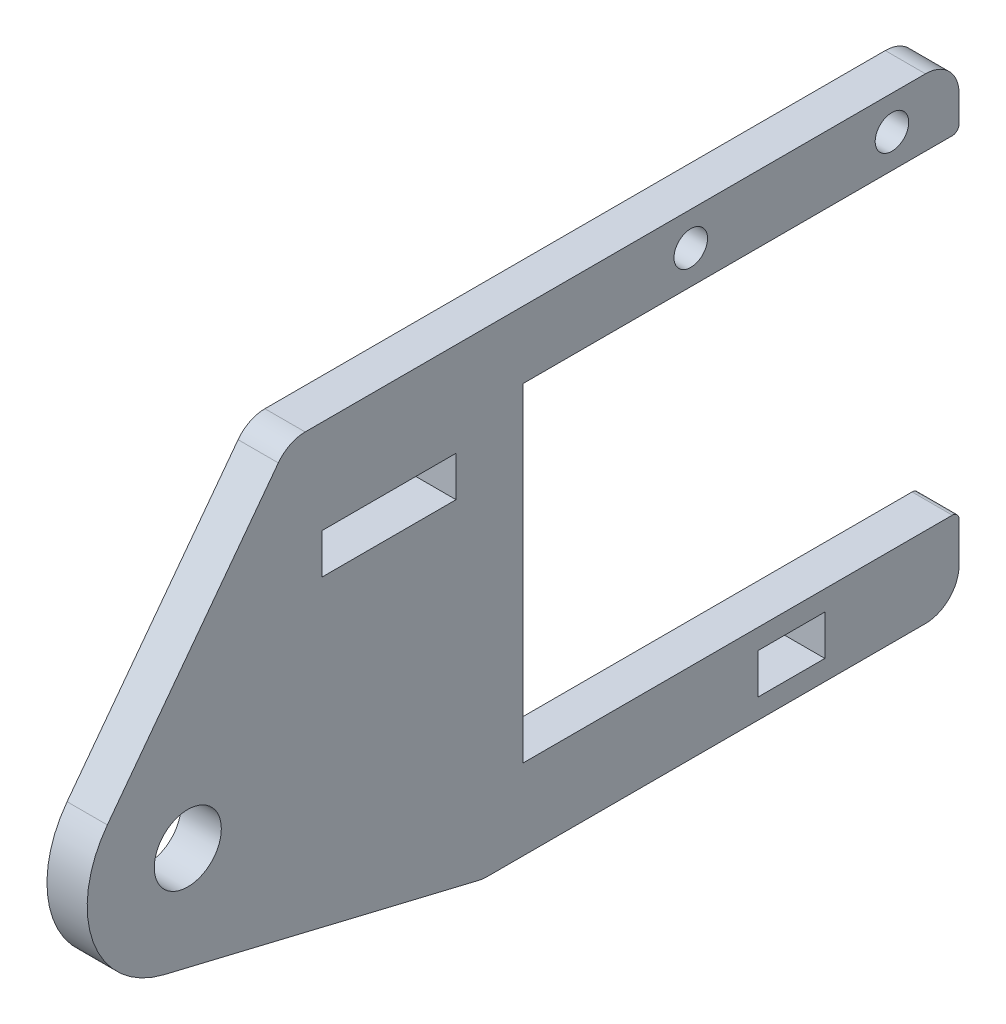
ISO-10303-21;
HEADER;
FILE_DESCRIPTION(('STEP AP214'),'2;1');
FILE_NAME('part.step','',(''),(''),'','','');
FILE_SCHEMA(('AUTOMOTIVE_DESIGN { 1 0 10303 214 1 1 1 1 }'));
ENDSEC;
DATA;
#1=APPLICATION_CONTEXT('core data for automotive mechanical design processes');
#2=APPLICATION_PROTOCOL_DEFINITION('international standard','automotive_design',2000,#1);
#3=PRODUCT_CONTEXT('',#1,'mechanical');
#4=PRODUCT('Part','Part','',(#3));
#5=PRODUCT_RELATED_PRODUCT_CATEGORY('part','',(#4));
#6=PRODUCT_DEFINITION_FORMATION('','',#4);
#7=PRODUCT_DEFINITION_CONTEXT('part definition',#1,'design');
#8=PRODUCT_DEFINITION('design','',#6,#7);
#9=PRODUCT_DEFINITION_SHAPE('','',#8);
#10=(LENGTH_UNIT() NAMED_UNIT(*) SI_UNIT(.MILLI.,.METRE.));
#11=(NAMED_UNIT(*) PLANE_ANGLE_UNIT() SI_UNIT($,.RADIAN.));
#12=(NAMED_UNIT(*) SI_UNIT($,.STERADIAN.) SOLID_ANGLE_UNIT());
#13=UNCERTAINTY_MEASURE_WITH_UNIT(LENGTH_MEASURE(1.E-05),#10,'distance_accuracy_value','');
#14=(GEOMETRIC_REPRESENTATION_CONTEXT(3) GLOBAL_UNCERTAINTY_ASSIGNED_CONTEXT((#13)) GLOBAL_UNIT_ASSIGNED_CONTEXT((#10,
#11,#12)) REPRESENTATION_CONTEXT('',''));
#15=CARTESIAN_POINT('',(0.,0.,0.));
#16=DIRECTION('',(0.,0.,1.));
#17=DIRECTION('',(1.,0.,0.));
#18=AXIS2_PLACEMENT_3D('',#15,#16,#17);
#19=CARTESIAN_POINT('',(6.,-30.,50.));
#20=DIRECTION('',(1.,0.,0.));
#21=DIRECTION('',(0.,0.,-1.));
#22=AXIS2_PLACEMENT_3D('',#19,#20,#21);
#23=PLANE('',#22);
#24=CARTESIAN_POINT('',(6.,10.,-55.));
#25=DIRECTION('',(1.,0.,0.));
#26=DIRECTION('',(0.,0.,-1.));
#27=AXIS2_PLACEMENT_3D('',#24,#25,#26);
#28=CIRCLE('',#27,2.5);
#29=CARTESIAN_POINT('',(6.,10.,-57.5));
#30=VERTEX_POINT('',#29);
#31=EDGE_CURVE('E267',#30,#30,#28,.T.);
#32=ORIENTED_EDGE('',*,*,#31,.F.);
#33=EDGE_LOOP('',(#32));
#34=FACE_BOUND('',#33,.T.);
#35=DIRECTION('',(0.,1.,0.));
#36=VECTOR('',#35,1.);
#37=CARTESIAN_POINT('',(6.,-56.,-65.));
#38=LINE('',#37,#36);
#39=CARTESIAN_POINT('',(6.,-51.,-65.));
#40=VERTEX_POINT('',#39);
#41=CARTESIAN_POINT('',(6.,-45.,-65.));
#42=VERTEX_POINT('',#41);
#43=EDGE_CURVE('E348',#40,#42,#38,.T.);
#44=ORIENTED_EDGE('',*,*,#43,.T.);
#45=CARTESIAN_POINT('',(6.,-45.,-64.));
#46=DIRECTION('',(1.,0.,0.));
#47=DIRECTION('',(0.,0.,-1.));
#48=AXIS2_PLACEMENT_3D('',#45,#46,#47);
#49=CIRCLE('',#48,1.);
#50=CARTESIAN_POINT('',(6.,-44.,-64.));
#51=VERTEX_POINT('',#50);
#52=EDGE_CURVE('E478',#42,#51,#49,.T.);
#53=ORIENTED_EDGE('',*,*,#52,.T.);
#54=DIRECTION('',(0.,0.,1.));
#55=VECTOR('',#54,1.);
#56=CARTESIAN_POINT('',(6.,-44.,-65.));
#57=LINE('',#56,#55);
#58=CARTESIAN_POINT('',(6.,-44.,0.));
#59=VERTEX_POINT('',#58);
#60=EDGE_CURVE('E352',#51,#59,#57,.T.);
#61=ORIENTED_EDGE('',*,*,#60,.T.);
#62=DIRECTION('',(0.,1.,0.));
#63=VECTOR('',#62,1.);
#64=CARTESIAN_POINT('',(6.,-44.,0.));
#65=LINE('',#64,#63);
#66=CARTESIAN_POINT('',(6.,5.,0.));
#67=VERTEX_POINT('',#66);
#68=EDGE_CURVE('E355',#59,#67,#65,.T.);
#69=ORIENTED_EDGE('',*,*,#68,.T.);
#70=DIRECTION('',(0.,0.,-1.));
#71=VECTOR('',#70,1.);
#72=CARTESIAN_POINT('',(6.,5.,0.));
#73=LINE('',#72,#71);
#74=CARTESIAN_POINT('',(6.,5.00000000000001,-64.));
#75=VERTEX_POINT('',#74);
#76=EDGE_CURVE('E358',#67,#75,#73,.T.);
#77=ORIENTED_EDGE('',*,*,#76,.T.);
#78=CARTESIAN_POINT('',(6.,6.00000000000001,-64.));
#79=DIRECTION('',(1.,0.,0.));
#80=DIRECTION('',(0.,0.,-1.));
#81=AXIS2_PLACEMENT_3D('',#78,#79,#80);
#82=CIRCLE('',#81,1.);
#83=CARTESIAN_POINT('',(6.,6.00000000000002,-65.));
#84=VERTEX_POINT('',#83);
#85=EDGE_CURVE('E59',#75,#84,#82,.T.);
#86=ORIENTED_EDGE('',*,*,#85,.T.);
#87=DIRECTION('',(0.,1.,0.));
#88=VECTOR('',#87,1.);
#89=CARTESIAN_POINT('',(6.,5.00000000000001,-65.));
#90=LINE('',#89,#88);
#91=CARTESIAN_POINT('',(6.,10.,-65.));
#92=VERTEX_POINT('',#91);
#93=EDGE_CURVE('E326',#84,#92,#90,.T.);
#94=ORIENTED_EDGE('',*,*,#93,.T.);
#95=CARTESIAN_POINT('',(6.,10.,-60.));
#96=DIRECTION('',(1.,0.,0.));
#97=DIRECTION('',(0.,0.,-1.));
#98=AXIS2_PLACEMENT_3D('',#95,#96,#97);
#99=CIRCLE('',#98,5.);
#100=CARTESIAN_POINT('',(6.,15.,-60.));
#101=VERTEX_POINT('',#100);
#102=EDGE_CURVE('E435',#92,#101,#99,.T.);
#103=ORIENTED_EDGE('',*,*,#102,.T.);
#104=DIRECTION('',(0.,0.,1.));
#105=VECTOR('',#104,1.);
#106=CARTESIAN_POINT('',(6.,15.,-65.));
#107=LINE('',#106,#105);
#108=CARTESIAN_POINT('',(6.,15.,32.5));
#109=VERTEX_POINT('',#108);
#110=EDGE_CURVE('E329',#101,#109,#107,.T.);
#111=ORIENTED_EDGE('',*,*,#110,.T.);
#112=CARTESIAN_POINT('',(6.,10.,32.5));
#113=DIRECTION('',(1.,0.,0.));
#114=DIRECTION('',(0.,0.,-1.));
#115=AXIS2_PLACEMENT_3D('',#112,#113,#114);
#116=CIRCLE('',#115,5.);
#117=CARTESIAN_POINT('',(6.,13.,36.5));
#118=VERTEX_POINT('',#117);
#119=EDGE_CURVE('E432',#109,#118,#116,.T.);
#120=ORIENTED_EDGE('',*,*,#119,.T.);
#121=DIRECTION('',(0.,-0.8,0.6));
#122=VECTOR('',#121,1.);
#123=CARTESIAN_POINT('',(6.,15.,35.));
#124=LINE('',#123,#122);
#125=CARTESIAN_POINT('',(6.,-21.,62.));
#126=VERTEX_POINT('',#125);
#127=EDGE_CURVE('E334',#118,#126,#124,.T.);
#128=ORIENTED_EDGE('',*,*,#127,.T.);
#129=CARTESIAN_POINT('',(6.,-30.,50.));
#130=DIRECTION('',(1.,0.,0.));
#131=DIRECTION('',(0.,0.,-1.));
#132=AXIS2_PLACEMENT_3D('',#129,#130,#131);
#133=CIRCLE('',#132,15.);
#134=CARTESIAN_POINT('',(6.,-44.5848301840766,53.5046723814998));
#135=VERTEX_POINT('',#134);
#136=EDGE_CURVE('E337',#126,#135,#133,.T.);
#137=ORIENTED_EDGE('',*,*,#136,.T.);
#138=DIRECTION('',(0.,-0.233644825433321,-0.972322012271774));
#139=VECTOR('',#138,1.);
#140=CARTESIAN_POINT('',(6.,-56.,5.99999999999999));
#141=LINE('',#140,#139);
#142=CARTESIAN_POINT('',(6.,-55.8616100613589,6.57591510262703));
#143=VERTEX_POINT('',#142);
#144=EDGE_CURVE('E340',#135,#143,#141,.T.);
#145=ORIENTED_EDGE('',*,*,#144,.T.);
#146=CARTESIAN_POINT('',(6.,-51.,5.40769097546042));
#147=DIRECTION('',(1.,0.,0.));
#148=DIRECTION('',(0.,0.,-1.));
#149=AXIS2_PLACEMENT_3D('',#146,#147,#148);
#150=CIRCLE('',#149,5.);
#151=CARTESIAN_POINT('',(6.,-56.,5.40769097546042));
#152=VERTEX_POINT('',#151);
#153=EDGE_CURVE('E441',#143,#152,#150,.T.);
#154=ORIENTED_EDGE('',*,*,#153,.T.);
#155=DIRECTION('',(0.,0.,-1.));
#156=VECTOR('',#155,1.);
#157=CARTESIAN_POINT('',(6.,-56.,5.99999999999999));
#158=LINE('',#157,#156);
#159=CARTESIAN_POINT('',(6.,-56.,-60.));
#160=VERTEX_POINT('',#159);
#161=EDGE_CURVE('E344',#152,#160,#158,.T.);
#162=ORIENTED_EDGE('',*,*,#161,.T.);
#163=CARTESIAN_POINT('',(6.,-51.,-60.));
#164=DIRECTION('',(1.,0.,0.));
#165=DIRECTION('',(0.,0.,-1.));
#166=AXIS2_PLACEMENT_3D('',#163,#164,#165);
#167=CIRCLE('',#166,5.);
#168=EDGE_CURVE('E438',#160,#40,#167,.T.);
#169=ORIENTED_EDGE('',*,*,#168,.T.);
#170=EDGE_LOOP('',(#44,#53,#61,#69,#77,#86,#94,#103,#111,#120,#128,#137,#145,#154,#162,#169));
#171=FACE_BOUND('',#170,.T.);
#172=CARTESIAN_POINT('',(6.,-30.,50.));
#173=DIRECTION('',(1.,0.,0.));
#174=DIRECTION('',(0.,0.,-1.));
#175=AXIS2_PLACEMENT_3D('',#172,#173,#174);
#176=CIRCLE('',#175,5.);
#177=CARTESIAN_POINT('',(6.,-30.,45.));
#178=VERTEX_POINT('',#177);
#179=EDGE_CURVE('E318',#178,#178,#176,.T.);
#180=ORIENTED_EDGE('',*,*,#179,.F.);
#181=EDGE_LOOP('',(#180));
#182=FACE_BOUND('',#181,.T.);
#183=DIRECTION('',(0.,0.,1.));
#184=VECTOR('',#183,1.);
#185=CARTESIAN_POINT('',(6.,-47.,-45.));
#186=LINE('',#185,#184);
#187=CARTESIAN_POINT('',(6.,-47.,-45.));
#188=VERTEX_POINT('',#187);
#189=CARTESIAN_POINT('',(6.,-47.,-35.));
#190=VERTEX_POINT('',#189);
#191=EDGE_CURVE('E278',#188,#190,#186,.T.);
#192=ORIENTED_EDGE('',*,*,#191,.F.);
#193=DIRECTION('',(0.,1.,0.));
#194=VECTOR('',#193,1.);
#195=CARTESIAN_POINT('',(6.,-47.,-45.));
#196=LINE('',#195,#194);
#197=CARTESIAN_POINT('',(6.,-53.,-45.));
#198=VERTEX_POINT('',#197);
#199=EDGE_CURVE('E275',#198,#188,#196,.T.);
#200=ORIENTED_EDGE('',*,*,#199,.F.);
#201=DIRECTION('',(0.,0.,-1.));
#202=VECTOR('',#201,1.);
#203=CARTESIAN_POINT('',(6.,-53.,-45.));
#204=LINE('',#203,#202);
#205=CARTESIAN_POINT('',(6.,-53.,-35.));
#206=VERTEX_POINT('',#205);
#207=EDGE_CURVE('E286',#206,#198,#204,.T.);
#208=ORIENTED_EDGE('',*,*,#207,.F.);
#209=DIRECTION('',(0.,-1.,0.));
#210=VECTOR('',#209,1.);
#211=CARTESIAN_POINT('',(6.,-47.,-35.));
#212=LINE('',#211,#210);
#213=EDGE_CURVE('E282',#190,#206,#212,.T.);
#214=ORIENTED_EDGE('',*,*,#213,.F.);
#215=EDGE_LOOP('',(#192,#200,#208,#214));
#216=FACE_BOUND('',#215,.T.);
#217=CARTESIAN_POINT('',(6.,10.,-25.));
#218=DIRECTION('',(1.,0.,0.));
#219=DIRECTION('',(0.,0.,-1.));
#220=AXIS2_PLACEMENT_3D('',#217,#218,#219);
#221=CIRCLE('',#220,2.5);
#222=CARTESIAN_POINT('',(6.,10.,-27.5));
#223=VERTEX_POINT('',#222);
#224=EDGE_CURVE('E259',#223,#223,#221,.T.);
#225=ORIENTED_EDGE('',*,*,#224,.F.);
#226=EDGE_LOOP('',(#225));
#227=FACE_BOUND('',#226,.T.);
#228=DIRECTION('',(0.,0.,1.));
#229=VECTOR('',#228,1.);
#230=CARTESIAN_POINT('',(6.,1.00000000000003,10.));
#231=LINE('',#230,#229);
#232=CARTESIAN_POINT('',(6.,1.00000000000003,10.));
#233=VERTEX_POINT('',#232);
#234=CARTESIAN_POINT('',(6.,1.00000000000001,30.));
#235=VERTEX_POINT('',#234);
#236=EDGE_CURVE('E217',#233,#235,#231,.T.);
#237=ORIENTED_EDGE('',*,*,#236,.F.);
#238=DIRECTION('',(0.,1.,0.));
#239=VECTOR('',#238,1.);
#240=CARTESIAN_POINT('',(6.,-4.99999999999997,10.));
#241=LINE('',#240,#239);
#242=CARTESIAN_POINT('',(6.,-4.99999999999997,10.));
#243=VERTEX_POINT('',#242);
#244=EDGE_CURVE('E206',#243,#233,#241,.T.);
#245=ORIENTED_EDGE('',*,*,#244,.F.);
#246=DIRECTION('',(0.,0.,-1.));
#247=VECTOR('',#246,1.);
#248=CARTESIAN_POINT('',(6.,-4.99999999999999,30.));
#249=LINE('',#248,#247);
#250=CARTESIAN_POINT('',(6.,-4.99999999999998,30.));
#251=VERTEX_POINT('',#250);
#252=EDGE_CURVE('E235',#251,#243,#249,.T.);
#253=ORIENTED_EDGE('',*,*,#252,.F.);
#254=DIRECTION('',(0.,-1.,0.));
#255=VECTOR('',#254,1.);
#256=CARTESIAN_POINT('',(6.,1.00000000000001,30.));
#257=LINE('',#256,#255);
#258=EDGE_CURVE('E231',#235,#251,#257,.T.);
#259=ORIENTED_EDGE('',*,*,#258,.F.);
#260=EDGE_LOOP('',(#237,#245,#253,#259));
#261=FACE_BOUND('',#260,.T.);
#262=ADVANCED_FACE('F43',(#34,#171,#182,#216,#227,#261),#23,.T.);
#263=CARTESIAN_POINT('',(0.,-30.,50.));
#264=DIRECTION('',(1.,0.,0.));
#265=DIRECTION('',(0.,0.,-1.));
#266=AXIS2_PLACEMENT_3D('',#263,#264,#265);
#267=PLANE('',#266);
#268=CARTESIAN_POINT('',(0.,10.,-25.));
#269=DIRECTION('',(1.,0.,0.));
#270=DIRECTION('',(0.,0.,-1.));
#271=AXIS2_PLACEMENT_3D('',#268,#269,#270);
#272=CIRCLE('',#271,2.5);
#273=CARTESIAN_POINT('',(0.,10.,-27.5));
#274=VERTEX_POINT('',#273);
#275=EDGE_CURVE('E226',#274,#274,#272,.T.);
#276=ORIENTED_EDGE('',*,*,#275,.T.);
#277=EDGE_LOOP('',(#276));
#278=FACE_BOUND('',#277,.T.);
#279=CARTESIAN_POINT('',(0.,10.,-55.));
#280=DIRECTION('',(1.,0.,0.));
#281=DIRECTION('',(0.,0.,-1.));
#282=AXIS2_PLACEMENT_3D('',#279,#280,#281);
#283=CIRCLE('',#282,2.5);
#284=CARTESIAN_POINT('',(0.,10.,-57.5));
#285=VERTEX_POINT('',#284);
#286=EDGE_CURVE('E263',#285,#285,#283,.T.);
#287=ORIENTED_EDGE('',*,*,#286,.T.);
#288=EDGE_LOOP('',(#287));
#289=FACE_BOUND('',#288,.T.);
#290=DIRECTION('',(0.,1.,0.));
#291=VECTOR('',#290,1.);
#292=CARTESIAN_POINT('',(0.,-47.,-45.));
#293=LINE('',#292,#291);
#294=CARTESIAN_POINT('',(0.,-53.,-45.));
#295=VERTEX_POINT('',#294);
#296=CARTESIAN_POINT('',(0.,-47.,-45.));
#297=VERTEX_POINT('',#296);
#298=EDGE_CURVE('E271',#295,#297,#293,.T.);
#299=ORIENTED_EDGE('',*,*,#298,.T.);
#300=DIRECTION('',(0.,0.,1.));
#301=VECTOR('',#300,1.);
#302=CARTESIAN_POINT('',(0.,-47.,-45.));
#303=LINE('',#302,#301);
#304=CARTESIAN_POINT('',(0.,-47.,-35.));
#305=VERTEX_POINT('',#304);
#306=EDGE_CURVE('E293',#297,#305,#303,.T.);
#307=ORIENTED_EDGE('',*,*,#306,.T.);
#308=DIRECTION('',(0.,-1.,0.));
#309=VECTOR('',#308,1.);
#310=CARTESIAN_POINT('',(0.,-47.,-35.));
#311=LINE('',#310,#309);
#312=CARTESIAN_POINT('',(0.,-53.,-35.));
#313=VERTEX_POINT('',#312);
#314=EDGE_CURVE('E297',#305,#313,#311,.T.);
#315=ORIENTED_EDGE('',*,*,#314,.T.);
#316=DIRECTION('',(0.,0.,-1.));
#317=VECTOR('',#316,1.);
#318=CARTESIAN_POINT('',(0.,-53.,-45.));
#319=LINE('',#318,#317);
#320=EDGE_CURVE('E279',#313,#295,#319,.T.);
#321=ORIENTED_EDGE('',*,*,#320,.T.);
#322=EDGE_LOOP('',(#299,#307,#315,#321));
#323=FACE_BOUND('',#322,.T.);
#324=DIRECTION('',(0.,0.,1.));
#325=VECTOR('',#324,1.);
#326=CARTESIAN_POINT('',(0.,-44.,-65.));
#327=LINE('',#326,#325);
#328=CARTESIAN_POINT('',(0.,-44.,-64.));
#329=VERTEX_POINT('',#328);
#330=CARTESIAN_POINT('',(0.,-44.,0.));
#331=VERTEX_POINT('',#330);
#332=EDGE_CURVE('E386',#329,#331,#327,.T.);
#333=ORIENTED_EDGE('',*,*,#332,.F.);
#334=CARTESIAN_POINT('',(0.,-45.,-64.));
#335=DIRECTION('',(1.,0.,0.));
#336=DIRECTION('',(0.,0.,-1.));
#337=AXIS2_PLACEMENT_3D('',#334,#335,#336);
#338=CIRCLE('',#337,1.);
#339=CARTESIAN_POINT('',(0.,-45.,-65.));
#340=VERTEX_POINT('',#339);
#341=EDGE_CURVE('E470',#329,#340,#338,.F.);
#342=ORIENTED_EDGE('',*,*,#341,.T.);
#343=DIRECTION('',(0.,1.,0.));
#344=VECTOR('',#343,1.);
#345=CARTESIAN_POINT('',(0.,-56.,-65.));
#346=LINE('',#345,#344);
#347=CARTESIAN_POINT('',(0.,-51.,-65.));
#348=VERTEX_POINT('',#347);
#349=EDGE_CURVE('E382',#348,#340,#346,.T.);
#350=ORIENTED_EDGE('',*,*,#349,.F.);
#351=CARTESIAN_POINT('',(0.,-51.,-60.));
#352=DIRECTION('',(1.,0.,0.));
#353=DIRECTION('',(0.,0.,-1.));
#354=AXIS2_PLACEMENT_3D('',#351,#352,#353);
#355=CIRCLE('',#354,5.);
#356=CARTESIAN_POINT('',(0.,-56.,-60.));
#357=VERTEX_POINT('',#356);
#358=EDGE_CURVE('E423',#348,#357,#355,.F.);
#359=ORIENTED_EDGE('',*,*,#358,.T.);
#360=DIRECTION('',(0.,0.,-1.));
#361=VECTOR('',#360,1.);
#362=CARTESIAN_POINT('',(0.,-56.,5.99999999999999));
#363=LINE('',#362,#361);
#364=CARTESIAN_POINT('',(0.,-56.,5.40769097546042));
#365=VERTEX_POINT('',#364);
#366=EDGE_CURVE('E378',#365,#357,#363,.T.);
#367=ORIENTED_EDGE('',*,*,#366,.F.);
#368=CARTESIAN_POINT('',(0.,-51.,5.40769097546042));
#369=DIRECTION('',(1.,0.,0.));
#370=DIRECTION('',(0.,0.,-1.));
#371=AXIS2_PLACEMENT_3D('',#368,#369,#370);
#372=CIRCLE('',#371,5.);
#373=CARTESIAN_POINT('',(0.,-55.8616100613589,6.57591510262703));
#374=VERTEX_POINT('',#373);
#375=EDGE_CURVE('E426',#365,#374,#372,.F.);
#376=ORIENTED_EDGE('',*,*,#375,.T.);
#377=DIRECTION('',(0.,-0.233644825433321,-0.972322012271774));
#378=VECTOR('',#377,1.);
#379=CARTESIAN_POINT('',(0.,-56.,5.99999999999999));
#380=LINE('',#379,#378);
#381=CARTESIAN_POINT('',(0.,-44.5848301840766,53.5046723814998));
#382=VERTEX_POINT('',#381);
#383=EDGE_CURVE('E374',#382,#374,#380,.T.);
#384=ORIENTED_EDGE('',*,*,#383,.F.);
#385=CARTESIAN_POINT('',(0.,-30.,50.));
#386=DIRECTION('',(1.,0.,0.));
#387=DIRECTION('',(0.,0.,-1.));
#388=AXIS2_PLACEMENT_3D('',#385,#386,#387);
#389=CIRCLE('',#388,15.);
#390=CARTESIAN_POINT('',(0.,-21.,62.));
#391=VERTEX_POINT('',#390);
#392=EDGE_CURVE('E371',#391,#382,#389,.T.);
#393=ORIENTED_EDGE('',*,*,#392,.F.);
#394=DIRECTION('',(0.,-0.8,0.6));
#395=VECTOR('',#394,1.);
#396=CARTESIAN_POINT('',(0.,15.,35.));
#397=LINE('',#396,#395);
#398=CARTESIAN_POINT('',(0.,13.,36.5));
#399=VERTEX_POINT('',#398);
#400=EDGE_CURVE('E368',#399,#391,#397,.T.);
#401=ORIENTED_EDGE('',*,*,#400,.F.);
#402=CARTESIAN_POINT('',(0.,10.,32.5));
#403=DIRECTION('',(1.,0.,0.));
#404=DIRECTION('',(0.,0.,-1.));
#405=AXIS2_PLACEMENT_3D('',#402,#403,#404);
#406=CIRCLE('',#405,5.);
#407=CARTESIAN_POINT('',(0.,15.,32.5));
#408=VERTEX_POINT('',#407);
#409=EDGE_CURVE('E416',#399,#408,#406,.F.);
#410=ORIENTED_EDGE('',*,*,#409,.T.);
#411=DIRECTION('',(0.,0.,1.));
#412=VECTOR('',#411,1.);
#413=CARTESIAN_POINT('',(0.,15.,-65.));
#414=LINE('',#413,#412);
#415=CARTESIAN_POINT('',(0.,15.,-60.));
#416=VERTEX_POINT('',#415);
#417=EDGE_CURVE('E364',#416,#408,#414,.T.);
#418=ORIENTED_EDGE('',*,*,#417,.F.);
#419=CARTESIAN_POINT('',(0.,10.,-60.));
#420=DIRECTION('',(1.,0.,0.));
#421=DIRECTION('',(0.,0.,-1.));
#422=AXIS2_PLACEMENT_3D('',#419,#420,#421);
#423=CIRCLE('',#422,5.);
#424=CARTESIAN_POINT('',(0.,10.,-65.));
#425=VERTEX_POINT('',#424);
#426=EDGE_CURVE('E419',#416,#425,#423,.F.);
#427=ORIENTED_EDGE('',*,*,#426,.T.);
#428=DIRECTION('',(0.,1.,0.));
#429=VECTOR('',#428,1.);
#430=CARTESIAN_POINT('',(0.,5.00000000000001,-65.));
#431=LINE('',#430,#429);
#432=CARTESIAN_POINT('',(0.,6.00000000000002,-65.));
#433=VERTEX_POINT('',#432);
#434=EDGE_CURVE('E322',#433,#425,#431,.T.);
#435=ORIENTED_EDGE('',*,*,#434,.F.);
#436=CARTESIAN_POINT('',(0.,6.00000000000001,-64.));
#437=DIRECTION('',(1.,0.,0.));
#438=DIRECTION('',(0.,0.,-1.));
#439=AXIS2_PLACEMENT_3D('',#436,#437,#438);
#440=CIRCLE('',#439,1.);
#441=CARTESIAN_POINT('',(0.,5.00000000000001,-64.));
#442=VERTEX_POINT('',#441);
#443=EDGE_CURVE('E467',#433,#442,#440,.F.);
#444=ORIENTED_EDGE('',*,*,#443,.T.);
#445=DIRECTION('',(0.,0.,-1.));
#446=VECTOR('',#445,1.);
#447=CARTESIAN_POINT('',(0.,5.,0.));
#448=LINE('',#447,#446);
#449=CARTESIAN_POINT('',(0.,5.,0.));
#450=VERTEX_POINT('',#449);
#451=EDGE_CURVE('E330',#450,#442,#448,.T.);
#452=ORIENTED_EDGE('',*,*,#451,.F.);
#453=DIRECTION('',(0.,1.,0.));
#454=VECTOR('',#453,1.);
#455=CARTESIAN_POINT('',(0.,-44.,0.));
#456=LINE('',#455,#454);
#457=EDGE_CURVE('E389',#331,#450,#456,.T.);
#458=ORIENTED_EDGE('',*,*,#457,.F.);
#459=EDGE_LOOP('',(#333,#342,#350,#359,#367,#376,#384,#393,#401,#410,#418,#427,#435,#444,#452,#458));
#460=FACE_BOUND('',#459,.T.);
#461=CARTESIAN_POINT('',(0.,-30.,50.));
#462=DIRECTION('',(1.,0.,0.));
#463=DIRECTION('',(0.,0.,-1.));
#464=AXIS2_PLACEMENT_3D('',#461,#462,#463);
#465=CIRCLE('',#464,5.);
#466=CARTESIAN_POINT('',(0.,-30.,45.));
#467=VERTEX_POINT('',#466);
#468=EDGE_CURVE('E317',#467,#467,#465,.T.);
#469=ORIENTED_EDGE('',*,*,#468,.T.);
#470=EDGE_LOOP('',(#469));
#471=FACE_BOUND('',#470,.T.);
#472=DIRECTION('',(0.,1.,0.));
#473=VECTOR('',#472,1.);
#474=CARTESIAN_POINT('',(0.,-4.99999999999997,10.));
#475=LINE('',#474,#473);
#476=CARTESIAN_POINT('',(0.,-4.99999999999997,10.));
#477=VERTEX_POINT('',#476);
#478=CARTESIAN_POINT('',(0.,1.00000000000003,10.));
#479=VERTEX_POINT('',#478);
#480=EDGE_CURVE('E240',#477,#479,#475,.T.);
#481=ORIENTED_EDGE('',*,*,#480,.T.);
#482=DIRECTION('',(0.,0.,1.));
#483=VECTOR('',#482,1.);
#484=CARTESIAN_POINT('',(0.,1.00000000000003,10.));
#485=LINE('',#484,#483);
#486=CARTESIAN_POINT('',(0.,1.00000000000001,30.));
#487=VERTEX_POINT('',#486);
#488=EDGE_CURVE('E224',#479,#487,#485,.T.);
#489=ORIENTED_EDGE('',*,*,#488,.T.);
#490=DIRECTION('',(0.,-1.,0.));
#491=VECTOR('',#490,1.);
#492=CARTESIAN_POINT('',(0.,1.00000000000001,30.));
#493=LINE('',#492,#491);
#494=CARTESIAN_POINT('',(0.,-4.99999999999999,30.));
#495=VERTEX_POINT('',#494);
#496=EDGE_CURVE('E245',#487,#495,#493,.T.);
#497=ORIENTED_EDGE('',*,*,#496,.T.);
#498=DIRECTION('',(0.,0.,-1.));
#499=VECTOR('',#498,1.);
#500=CARTESIAN_POINT('',(0.,-4.99999999999999,30.));
#501=LINE('',#500,#499);
#502=EDGE_CURVE('E218',#495,#477,#501,.T.);
#503=ORIENTED_EDGE('',*,*,#502,.T.);
#504=EDGE_LOOP('',(#481,#489,#497,#503));
#505=FACE_BOUND('',#504,.T.);
#506=ADVANCED_FACE('F489',(#278,#289,#323,#460,#471,#505),#267,.F.);
#507=CARTESIAN_POINT('',(6.,5.00000000000001,-65.));
#508=DIRECTION('',(0.,0.,1.));
#509=DIRECTION('',(0.,-1.,0.));
#510=AXIS2_PLACEMENT_3D('',#507,#508,#509);
#511=PLANE('',#510);
#512=ORIENTED_EDGE('',*,*,#93,.F.);
#513=DIRECTION('',(-1.,0.,0.));
#514=VECTOR('',#513,1.);
#515=CARTESIAN_POINT('',(6.,6.00000000000002,-65.));
#516=LINE('',#515,#514);
#517=EDGE_CURVE('E52',#84,#433,#516,.T.);
#518=ORIENTED_EDGE('',*,*,#517,.T.);
#519=ORIENTED_EDGE('',*,*,#434,.T.);
#520=DIRECTION('',(-1.,0.,0.));
#521=VECTOR('',#520,1.);
#522=CARTESIAN_POINT('',(6.,10.,-65.));
#523=LINE('',#522,#521);
#524=EDGE_CURVE('E455',#425,#92,#523,.F.);
#525=ORIENTED_EDGE('',*,*,#524,.T.);
#526=EDGE_LOOP('',(#512,#518,#519,#525));
#527=FACE_BOUND('',#526,.T.);
#528=ADVANCED_FACE('F485',(#527),#511,.F.);
#529=CARTESIAN_POINT('',(6.,15.,-65.));
#530=DIRECTION('',(0.,-1.,0.));
#531=DIRECTION('',(0.,0.,-1.));
#532=AXIS2_PLACEMENT_3D('',#529,#530,#531);
#533=PLANE('',#532);
#534=ORIENTED_EDGE('',*,*,#110,.F.);
#535=DIRECTION('',(-1.,0.,0.));
#536=VECTOR('',#535,1.);
#537=CARTESIAN_POINT('',(6.,15.,-60.));
#538=LINE('',#537,#536);
#539=EDGE_CURVE('E451',#101,#416,#538,.T.);
#540=ORIENTED_EDGE('',*,*,#539,.T.);
#541=ORIENTED_EDGE('',*,*,#417,.T.);
#542=DIRECTION('',(-1.,0.,0.));
#543=VECTOR('',#542,1.);
#544=CARTESIAN_POINT('',(6.,15.,32.5));
#545=LINE('',#544,#543);
#546=EDGE_CURVE('E448',#408,#109,#545,.F.);
#547=ORIENTED_EDGE('',*,*,#546,.T.);
#548=EDGE_LOOP('',(#534,#540,#541,#547));
#549=FACE_BOUND('',#548,.T.);
#550=ADVANCED_FACE('F502',(#549),#533,.F.);
#551=CARTESIAN_POINT('',(6.,15.,35.));
#552=DIRECTION('',(0.,-0.6,-0.8));
#553=DIRECTION('',(0.,0.8,-0.6));
#554=AXIS2_PLACEMENT_3D('',#551,#552,#553);
#555=PLANE('',#554);
#556=ORIENTED_EDGE('',*,*,#127,.F.);
#557=DIRECTION('',(-1.,0.,0.));
#558=VECTOR('',#557,1.);
#559=CARTESIAN_POINT('',(6.,13.,36.5));
#560=LINE('',#559,#558);
#561=EDGE_CURVE('E459',#118,#399,#560,.T.);
#562=ORIENTED_EDGE('',*,*,#561,.T.);
#563=ORIENTED_EDGE('',*,*,#400,.T.);
#564=DIRECTION('',(-1.,0.,0.));
#565=VECTOR('',#564,1.);
#566=CARTESIAN_POINT('',(6.,-21.,62.));
#567=LINE('',#566,#565);
#568=EDGE_CURVE('E405',#126,#391,#567,.T.);
#569=ORIENTED_EDGE('',*,*,#568,.F.);
#570=EDGE_LOOP('',(#556,#562,#563,#569));
#571=FACE_BOUND('',#570,.T.);
#572=ADVANCED_FACE('F510',(#571),#555,.F.);
#573=CARTESIAN_POINT('',(6.,-30.,50.));
#574=DIRECTION('',(-1.,0.,0.));
#575=DIRECTION('',(0.,0.,1.));
#576=AXIS2_PLACEMENT_3D('',#573,#574,#575);
#577=CYLINDRICAL_SURFACE('',#576,15.);
#578=ORIENTED_EDGE('',*,*,#392,.T.);
#579=DIRECTION('',(-1.,0.,0.));
#580=VECTOR('',#579,1.);
#581=CARTESIAN_POINT('',(6.,-44.5848301840766,53.5046723814998));
#582=LINE('',#581,#580);
#583=EDGE_CURVE('E401',#135,#382,#582,.T.);
#584=ORIENTED_EDGE('',*,*,#583,.F.);
#585=ORIENTED_EDGE('',*,*,#136,.F.);
#586=ORIENTED_EDGE('',*,*,#568,.T.);
#587=EDGE_LOOP('',(#578,#584,#585,#586));
#588=FACE_BOUND('',#587,.T.);
#589=ADVANCED_FACE('F516',(#588),#577,.T.);
#590=CARTESIAN_POINT('',(6.,-56.,5.99999999999999));
#591=DIRECTION('',(0.,0.972322012271774,-0.233644825433321));
#592=DIRECTION('',(0.,0.233644825433322,0.972322012271775));
#593=AXIS2_PLACEMENT_3D('',#590,#591,#592);
#594=PLANE('',#593);
#595=ORIENTED_EDGE('',*,*,#383,.T.);
#596=DIRECTION('',(-1.,0.,0.));
#597=VECTOR('',#596,1.);
#598=CARTESIAN_POINT('',(6.,-55.8616100613589,6.57591510262703));
#599=LINE('',#598,#597);
#600=EDGE_CURVE('E429',#374,#143,#599,.F.);
#601=ORIENTED_EDGE('',*,*,#600,.T.);
#602=ORIENTED_EDGE('',*,*,#144,.F.);
#603=ORIENTED_EDGE('',*,*,#583,.T.);
#604=EDGE_LOOP('',(#595,#601,#602,#603));
#605=FACE_BOUND('',#604,.T.);
#606=ADVANCED_FACE('F580',(#605),#594,.F.);
#607=CARTESIAN_POINT('',(6.,-56.,5.99999999999999));
#608=DIRECTION('',(0.,1.,0.));
#609=DIRECTION('',(0.,0.,1.));
#610=AXIS2_PLACEMENT_3D('',#607,#608,#609);
#611=PLANE('',#610);
#612=ORIENTED_EDGE('',*,*,#161,.F.);
#613=DIRECTION('',(-1.,0.,0.));
#614=VECTOR('',#613,1.);
#615=CARTESIAN_POINT('',(6.,-56.,5.40769097546042));
#616=LINE('',#615,#614);
#617=EDGE_CURVE('E412',#152,#365,#616,.T.);
#618=ORIENTED_EDGE('',*,*,#617,.T.);
#619=ORIENTED_EDGE('',*,*,#366,.T.);
#620=DIRECTION('',(-1.,0.,0.));
#621=VECTOR('',#620,1.);
#622=CARTESIAN_POINT('',(6.,-56.,-60.));
#623=LINE('',#622,#621);
#624=EDGE_CURVE('E409',#357,#160,#623,.F.);
#625=ORIENTED_EDGE('',*,*,#624,.T.);
#626=EDGE_LOOP('',(#612,#618,#619,#625));
#627=FACE_BOUND('',#626,.T.);
#628=ADVANCED_FACE('F527',(#627),#611,.F.);
#629=CARTESIAN_POINT('',(6.,-56.,-65.));
#630=DIRECTION('',(0.,0.,1.));
#631=DIRECTION('',(0.,-1.,0.));
#632=AXIS2_PLACEMENT_3D('',#629,#630,#631);
#633=PLANE('',#632);
#634=ORIENTED_EDGE('',*,*,#349,.T.);
#635=DIRECTION('',(-1.,0.,0.));
#636=VECTOR('',#635,1.);
#637=CARTESIAN_POINT('',(6.,-45.,-65.));
#638=LINE('',#637,#636);
#639=EDGE_CURVE('E473',#340,#42,#638,.F.);
#640=ORIENTED_EDGE('',*,*,#639,.T.);
#641=ORIENTED_EDGE('',*,*,#43,.F.);
#642=DIRECTION('',(-1.,0.,0.));
#643=VECTOR('',#642,1.);
#644=CARTESIAN_POINT('',(6.,-51.,-65.));
#645=LINE('',#644,#643);
#646=EDGE_CURVE('E444',#40,#348,#645,.T.);
#647=ORIENTED_EDGE('',*,*,#646,.T.);
#648=EDGE_LOOP('',(#634,#640,#641,#647));
#649=FACE_BOUND('',#648,.T.);
#650=ADVANCED_FACE('F537',(#649),#633,.F.);
#651=CARTESIAN_POINT('',(6.,-44.,-65.));
#652=DIRECTION('',(0.,-1.,0.));
#653=DIRECTION('',(0.,0.,-1.));
#654=AXIS2_PLACEMENT_3D('',#651,#652,#653);
#655=PLANE('',#654);
#656=ORIENTED_EDGE('',*,*,#60,.F.);
#657=DIRECTION('',(-1.,0.,0.));
#658=VECTOR('',#657,1.);
#659=CARTESIAN_POINT('',(6.,-44.,-64.));
#660=LINE('',#659,#658);
#661=EDGE_CURVE('E463',#51,#329,#660,.T.);
#662=ORIENTED_EDGE('',*,*,#661,.T.);
#663=ORIENTED_EDGE('',*,*,#332,.T.);
#664=DIRECTION('',(-1.,0.,0.));
#665=VECTOR('',#664,1.);
#666=CARTESIAN_POINT('',(6.,-44.,0.));
#667=LINE('',#666,#665);
#668=EDGE_CURVE('E397',#59,#331,#667,.T.);
#669=ORIENTED_EDGE('',*,*,#668,.F.);
#670=EDGE_LOOP('',(#656,#662,#663,#669));
#671=FACE_BOUND('',#670,.T.);
#672=ADVANCED_FACE('F545',(#671),#655,.F.);
#673=CARTESIAN_POINT('',(6.,-44.,0.));
#674=DIRECTION('',(0.,0.,1.));
#675=DIRECTION('',(0.,-1.,0.));
#676=AXIS2_PLACEMENT_3D('',#673,#674,#675);
#677=PLANE('',#676);
#678=ORIENTED_EDGE('',*,*,#457,.T.);
#679=DIRECTION('',(-1.,0.,0.));
#680=VECTOR('',#679,1.);
#681=CARTESIAN_POINT('',(6.,5.,0.));
#682=LINE('',#681,#680);
#683=EDGE_CURVE('E361',#67,#450,#682,.T.);
#684=ORIENTED_EDGE('',*,*,#683,.F.);
#685=ORIENTED_EDGE('',*,*,#68,.F.);
#686=ORIENTED_EDGE('',*,*,#668,.T.);
#687=EDGE_LOOP('',(#678,#684,#685,#686));
#688=FACE_BOUND('',#687,.T.);
#689=ADVANCED_FACE('F550',(#688),#677,.F.);
#690=CARTESIAN_POINT('',(6.,5.,0.));
#691=DIRECTION('',(0.,1.,0.));
#692=DIRECTION('',(0.,0.,1.));
#693=AXIS2_PLACEMENT_3D('',#690,#691,#692);
#694=PLANE('',#693);
#695=ORIENTED_EDGE('',*,*,#451,.T.);
#696=DIRECTION('',(-1.,0.,0.));
#697=VECTOR('',#696,1.);
#698=CARTESIAN_POINT('',(6.,5.00000000000001,-64.));
#699=LINE('',#698,#697);
#700=EDGE_CURVE('E11',#442,#75,#699,.F.);
#701=ORIENTED_EDGE('',*,*,#700,.T.);
#702=ORIENTED_EDGE('',*,*,#76,.F.);
#703=ORIENTED_EDGE('',*,*,#683,.T.);
#704=EDGE_LOOP('',(#695,#701,#702,#703));
#705=FACE_BOUND('',#704,.T.);
#706=ADVANCED_FACE('F552',(#705),#694,.F.);
#707=CARTESIAN_POINT('',(6.,-30.,50.));
#708=DIRECTION('',(-1.,0.,0.));
#709=DIRECTION('',(0.,0.,1.));
#710=AXIS2_PLACEMENT_3D('',#707,#708,#709);
#711=CYLINDRICAL_SURFACE('',#710,5.);
#712=ORIENTED_EDGE('',*,*,#179,.T.);
#713=EDGE_LOOP('',(#712));
#714=FACE_BOUND('',#713,.T.);
#715=ORIENTED_EDGE('',*,*,#468,.F.);
#716=EDGE_LOOP('',(#715));
#717=FACE_BOUND('',#716,.T.);
#718=ADVANCED_FACE('F567',(#714,#717),#711,.F.);
#719=CARTESIAN_POINT('',(6.,-47.,-45.));
#720=DIRECTION('',(0.,0.,1.));
#721=DIRECTION('',(1.,0.,0.));
#722=AXIS2_PLACEMENT_3D('',#719,#720,#721);
#723=PLANE('',#722);
#724=ORIENTED_EDGE('',*,*,#298,.F.);
#725=DIRECTION('',(-1.,0.,0.));
#726=VECTOR('',#725,1.);
#727=CARTESIAN_POINT('',(6.,-53.,-45.));
#728=LINE('',#727,#726);
#729=EDGE_CURVE('E289',#198,#295,#728,.T.);
#730=ORIENTED_EDGE('',*,*,#729,.F.);
#731=ORIENTED_EDGE('',*,*,#199,.T.);
#732=DIRECTION('',(-1.,0.,0.));
#733=VECTOR('',#732,1.);
#734=CARTESIAN_POINT('',(6.,-47.,-45.));
#735=LINE('',#734,#733);
#736=EDGE_CURVE('E313',#188,#297,#735,.T.);
#737=ORIENTED_EDGE('',*,*,#736,.T.);
#738=EDGE_LOOP('',(#724,#730,#731,#737));
#739=FACE_BOUND('',#738,.T.);
#740=ADVANCED_FACE('F725',(#739),#723,.T.);
#741=CARTESIAN_POINT('',(6.,-47.,-45.));
#742=DIRECTION('',(0.,-1.,0.));
#743=DIRECTION('',(0.,0.,-1.));
#744=AXIS2_PLACEMENT_3D('',#741,#742,#743);
#745=PLANE('',#744);
#746=ORIENTED_EDGE('',*,*,#306,.F.);
#747=ORIENTED_EDGE('',*,*,#736,.F.);
#748=ORIENTED_EDGE('',*,*,#191,.T.);
#749=DIRECTION('',(-1.,0.,0.));
#750=VECTOR('',#749,1.);
#751=CARTESIAN_POINT('',(6.,-47.,-35.));
#752=LINE('',#751,#750);
#753=EDGE_CURVE('E310',#190,#305,#752,.T.);
#754=ORIENTED_EDGE('',*,*,#753,.T.);
#755=EDGE_LOOP('',(#746,#747,#748,#754));
#756=FACE_BOUND('',#755,.T.);
#757=ADVANCED_FACE('F715',(#756),#745,.T.);
#758=CARTESIAN_POINT('',(6.,-47.,-35.));
#759=DIRECTION('',(0.,0.,-1.));
#760=DIRECTION('',(-1.,0.,0.));
#761=AXIS2_PLACEMENT_3D('',#758,#759,#760);
#762=PLANE('',#761);
#763=ORIENTED_EDGE('',*,*,#314,.F.);
#764=ORIENTED_EDGE('',*,*,#753,.F.);
#765=ORIENTED_EDGE('',*,*,#213,.T.);
#766=DIRECTION('',(-1.,0.,0.));
#767=VECTOR('',#766,1.);
#768=CARTESIAN_POINT('',(6.,-53.,-35.));
#769=LINE('',#768,#767);
#770=EDGE_CURVE('E307',#206,#313,#769,.T.);
#771=ORIENTED_EDGE('',*,*,#770,.T.);
#772=EDGE_LOOP('',(#763,#764,#765,#771));
#773=FACE_BOUND('',#772,.T.);
#774=ADVANCED_FACE('F705',(#773),#762,.T.);
#775=CARTESIAN_POINT('',(6.,-53.,-45.));
#776=DIRECTION('',(0.,1.,0.));
#777=DIRECTION('',(0.,0.,1.));
#778=AXIS2_PLACEMENT_3D('',#775,#776,#777);
#779=PLANE('',#778);
#780=ORIENTED_EDGE('',*,*,#320,.F.);
#781=ORIENTED_EDGE('',*,*,#770,.F.);
#782=ORIENTED_EDGE('',*,*,#207,.T.);
#783=ORIENTED_EDGE('',*,*,#729,.T.);
#784=EDGE_LOOP('',(#780,#781,#782,#783));
#785=FACE_BOUND('',#784,.T.);
#786=ADVANCED_FACE('F695',(#785),#779,.T.);
#787=CARTESIAN_POINT('',(6.,10.,-55.));
#788=DIRECTION('',(-1.,0.,0.));
#789=DIRECTION('',(0.,0.,1.));
#790=AXIS2_PLACEMENT_3D('',#787,#788,#789);
#791=CYLINDRICAL_SURFACE('',#790,2.5);
#792=ORIENTED_EDGE('',*,*,#31,.T.);
#793=EDGE_LOOP('',(#792));
#794=FACE_BOUND('',#793,.T.);
#795=ORIENTED_EDGE('',*,*,#286,.F.);
#796=EDGE_LOOP('',(#795));
#797=FACE_BOUND('',#796,.T.);
#798=ADVANCED_FACE('F685',(#794,#797),#791,.F.);
#799=CARTESIAN_POINT('',(6.,10.,-25.));
#800=DIRECTION('',(-1.,0.,0.));
#801=DIRECTION('',(0.,0.,1.));
#802=AXIS2_PLACEMENT_3D('',#799,#800,#801);
#803=CYLINDRICAL_SURFACE('',#802,2.5);
#804=ORIENTED_EDGE('',*,*,#224,.T.);
#805=EDGE_LOOP('',(#804));
#806=FACE_BOUND('',#805,.T.);
#807=ORIENTED_EDGE('',*,*,#275,.F.);
#808=EDGE_LOOP('',(#807));
#809=FACE_BOUND('',#808,.T.);
#810=ADVANCED_FACE('F676',(#806,#809),#803,.F.);
#811=CARTESIAN_POINT('',(6.,-4.99999999999997,10.));
#812=DIRECTION('',(0.,0.,1.));
#813=DIRECTION('',(0.,-1.,0.));
#814=AXIS2_PLACEMENT_3D('',#811,#812,#813);
#815=PLANE('',#814);
#816=ORIENTED_EDGE('',*,*,#480,.F.);
#817=DIRECTION('',(-1.,0.,0.));
#818=VECTOR('',#817,1.);
#819=CARTESIAN_POINT('',(6.,-4.99999999999997,10.));
#820=LINE('',#819,#818);
#821=EDGE_CURVE('E212',#243,#477,#820,.T.);
#822=ORIENTED_EDGE('',*,*,#821,.F.);
#823=ORIENTED_EDGE('',*,*,#244,.T.);
#824=DIRECTION('',(-1.,0.,0.));
#825=VECTOR('',#824,1.);
#826=CARTESIAN_POINT('',(6.,1.00000000000003,10.));
#827=LINE('',#826,#825);
#828=EDGE_CURVE('E209',#233,#479,#827,.T.);
#829=ORIENTED_EDGE('',*,*,#828,.T.);
#830=EDGE_LOOP('',(#816,#822,#823,#829));
#831=FACE_BOUND('',#830,.T.);
#832=ADVANCED_FACE('F208',(#831),#815,.T.);
#833=CARTESIAN_POINT('',(6.,1.00000000000003,10.));
#834=DIRECTION('',(0.,-1.,0.));
#835=DIRECTION('',(0.,0.,-1.));
#836=AXIS2_PLACEMENT_3D('',#833,#834,#835);
#837=PLANE('',#836);
#838=ORIENTED_EDGE('',*,*,#488,.F.);
#839=ORIENTED_EDGE('',*,*,#828,.F.);
#840=ORIENTED_EDGE('',*,*,#236,.T.);
#841=DIRECTION('',(-1.,0.,0.));
#842=VECTOR('',#841,1.);
#843=CARTESIAN_POINT('',(6.,1.00000000000001,30.));
#844=LINE('',#843,#842);
#845=EDGE_CURVE('E227',#235,#487,#844,.T.);
#846=ORIENTED_EDGE('',*,*,#845,.T.);
#847=EDGE_LOOP('',(#838,#839,#840,#846));
#848=FACE_BOUND('',#847,.T.);
#849=ADVANCED_FACE('F221',(#848),#837,.T.);
#850=CARTESIAN_POINT('',(6.,1.00000000000001,30.));
#851=DIRECTION('',(0.,0.,-1.));
#852=DIRECTION('',(0.,1.,0.));
#853=AXIS2_PLACEMENT_3D('',#850,#851,#852);
#854=PLANE('',#853);
#855=ORIENTED_EDGE('',*,*,#496,.F.);
#856=ORIENTED_EDGE('',*,*,#845,.F.);
#857=ORIENTED_EDGE('',*,*,#258,.T.);
#858=DIRECTION('',(-1.,0.,0.));
#859=VECTOR('',#858,1.);
#860=CARTESIAN_POINT('',(6.,-4.99999999999999,30.));
#861=LINE('',#860,#859);
#862=EDGE_CURVE('E254',#251,#495,#861,.T.);
#863=ORIENTED_EDGE('',*,*,#862,.T.);
#864=EDGE_LOOP('',(#855,#856,#857,#863));
#865=FACE_BOUND('',#864,.T.);
#866=ADVANCED_FACE('F649',(#865),#854,.T.);
#867=CARTESIAN_POINT('',(6.,-4.99999999999999,30.));
#868=DIRECTION('',(0.,1.,0.));
#869=DIRECTION('',(0.,0.,1.));
#870=AXIS2_PLACEMENT_3D('',#867,#868,#869);
#871=PLANE('',#870);
#872=ORIENTED_EDGE('',*,*,#502,.F.);
#873=ORIENTED_EDGE('',*,*,#862,.F.);
#874=ORIENTED_EDGE('',*,*,#252,.T.);
#875=ORIENTED_EDGE('',*,*,#821,.T.);
#876=EDGE_LOOP('',(#872,#873,#874,#875));
#877=FACE_BOUND('',#876,.T.);
#878=ADVANCED_FACE('F593',(#877),#871,.T.);
#879=CARTESIAN_POINT('',(6.,-51.,5.40769097546042));
#880=DIRECTION('',(-1.,0.,0.));
#881=DIRECTION('',(0.,0.,1.));
#882=AXIS2_PLACEMENT_3D('',#879,#880,#881);
#883=CYLINDRICAL_SURFACE('',#882,5.);
#884=ORIENTED_EDGE('',*,*,#153,.F.);
#885=ORIENTED_EDGE('',*,*,#600,.F.);
#886=ORIENTED_EDGE('',*,*,#375,.F.);
#887=ORIENTED_EDGE('',*,*,#617,.F.);
#888=EDGE_LOOP('',(#884,#885,#886,#887));
#889=FACE_BOUND('',#888,.T.);
#890=ADVANCED_FACE('F524',(#889),#883,.T.);
#891=CARTESIAN_POINT('',(6.,-51.,-60.));
#892=DIRECTION('',(-1.,0.,0.));
#893=DIRECTION('',(0.,0.,1.));
#894=AXIS2_PLACEMENT_3D('',#891,#892,#893);
#895=CYLINDRICAL_SURFACE('',#894,5.);
#896=ORIENTED_EDGE('',*,*,#168,.F.);
#897=ORIENTED_EDGE('',*,*,#624,.F.);
#898=ORIENTED_EDGE('',*,*,#358,.F.);
#899=ORIENTED_EDGE('',*,*,#646,.F.);
#900=EDGE_LOOP('',(#896,#897,#898,#899));
#901=FACE_BOUND('',#900,.T.);
#902=ADVANCED_FACE('F534',(#901),#895,.T.);
#903=CARTESIAN_POINT('',(6.,10.,-60.));
#904=DIRECTION('',(-1.,0.,0.));
#905=DIRECTION('',(0.,0.,1.));
#906=AXIS2_PLACEMENT_3D('',#903,#904,#905);
#907=CYLINDRICAL_SURFACE('',#906,5.);
#908=ORIENTED_EDGE('',*,*,#102,.F.);
#909=ORIENTED_EDGE('',*,*,#524,.F.);
#910=ORIENTED_EDGE('',*,*,#426,.F.);
#911=ORIENTED_EDGE('',*,*,#539,.F.);
#912=EDGE_LOOP('',(#908,#909,#910,#911));
#913=FACE_BOUND('',#912,.T.);
#914=ADVANCED_FACE('F497',(#913),#907,.T.);
#915=CARTESIAN_POINT('',(6.,10.,32.5));
#916=DIRECTION('',(-1.,0.,0.));
#917=DIRECTION('',(0.,0.,1.));
#918=AXIS2_PLACEMENT_3D('',#915,#916,#917);
#919=CYLINDRICAL_SURFACE('',#918,5.);
#920=ORIENTED_EDGE('',*,*,#119,.F.);
#921=ORIENTED_EDGE('',*,*,#546,.F.);
#922=ORIENTED_EDGE('',*,*,#409,.F.);
#923=ORIENTED_EDGE('',*,*,#561,.F.);
#924=EDGE_LOOP('',(#920,#921,#922,#923));
#925=FACE_BOUND('',#924,.T.);
#926=ADVANCED_FACE('F505',(#925),#919,.T.);
#927=CARTESIAN_POINT('',(6.,-45.,-64.));
#928=DIRECTION('',(-1.,0.,0.));
#929=DIRECTION('',(0.,0.,1.));
#930=AXIS2_PLACEMENT_3D('',#927,#928,#929);
#931=CYLINDRICAL_SURFACE('',#930,1.);
#932=ORIENTED_EDGE('',*,*,#52,.F.);
#933=ORIENTED_EDGE('',*,*,#639,.F.);
#934=ORIENTED_EDGE('',*,*,#341,.F.);
#935=ORIENTED_EDGE('',*,*,#661,.F.);
#936=EDGE_LOOP('',(#932,#933,#934,#935));
#937=FACE_BOUND('',#936,.T.);
#938=ADVANCED_FACE('F543',(#937),#931,.T.);
#939=CARTESIAN_POINT('',(6.,6.00000000000001,-64.));
#940=DIRECTION('',(-1.,0.,0.));
#941=DIRECTION('',(0.,0.,1.));
#942=AXIS2_PLACEMENT_3D('',#939,#940,#941);
#943=CYLINDRICAL_SURFACE('',#942,1.);
#944=ORIENTED_EDGE('',*,*,#85,.F.);
#945=ORIENTED_EDGE('',*,*,#700,.F.);
#946=ORIENTED_EDGE('',*,*,#443,.F.);
#947=ORIENTED_EDGE('',*,*,#517,.F.);
#948=EDGE_LOOP('',(#944,#945,#946,#947));
#949=FACE_BOUND('',#948,.T.);
#950=ADVANCED_FACE('F45',(#949),#943,.T.);
#951=CLOSED_SHELL('',(#262,#506,#528,#550,#572,#589,#606,#628,#650,#672,#689,#706,#718,#740,
#757,#774,#786,#798,#810,#832,#849,#866,#878,#890,#902,#914,#926,#938,#950));
#952=MANIFOLD_SOLID_BREP('B2',#951);
#953=ADVANCED_BREP_SHAPE_REPRESENTATION('',(#18,#952),#14);
#954=SHAPE_DEFINITION_REPRESENTATION(#9,#953);
ENDSEC;
END-ISO-10303-21;
